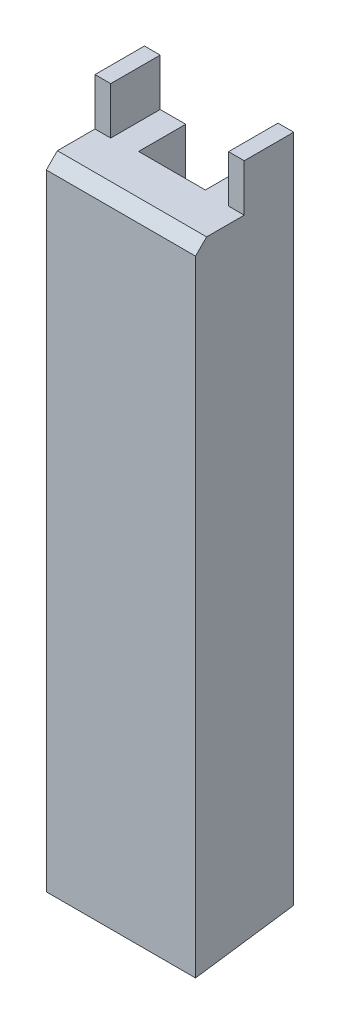
ISO-10303-21;
HEADER;
FILE_DESCRIPTION(('STEP AP214'),'2;1');
FILE_NAME('part.step','',(''),(''),'','','');
FILE_SCHEMA(('AUTOMOTIVE_DESIGN { 1 0 10303 214 1 1 1 1 }'));
ENDSEC;
DATA;
#1=APPLICATION_CONTEXT('core data for automotive mechanical design processes');
#2=APPLICATION_PROTOCOL_DEFINITION('international standard','automotive_design',2000,#1);
#3=PRODUCT_CONTEXT('',#1,'mechanical');
#4=PRODUCT('Part','Part','',(#3));
#5=PRODUCT_RELATED_PRODUCT_CATEGORY('part','',(#4));
#6=PRODUCT_DEFINITION_FORMATION('','',#4);
#7=PRODUCT_DEFINITION_CONTEXT('part definition',#1,'design');
#8=PRODUCT_DEFINITION('design','',#6,#7);
#9=PRODUCT_DEFINITION_SHAPE('','',#8);
#10=(LENGTH_UNIT() NAMED_UNIT(*) SI_UNIT(.MILLI.,.METRE.));
#11=(NAMED_UNIT(*) PLANE_ANGLE_UNIT() SI_UNIT($,.RADIAN.));
#12=(NAMED_UNIT(*) SI_UNIT($,.STERADIAN.) SOLID_ANGLE_UNIT());
#13=UNCERTAINTY_MEASURE_WITH_UNIT(LENGTH_MEASURE(1.E-05),#10,'distance_accuracy_value','');
#14=(GEOMETRIC_REPRESENTATION_CONTEXT(3) GLOBAL_UNCERTAINTY_ASSIGNED_CONTEXT((#13)) GLOBAL_UNIT_ASSIGNED_CONTEXT((#10,
#11,#12)) REPRESENTATION_CONTEXT('',''));
#15=CARTESIAN_POINT('',(0.,0.,0.));
#16=DIRECTION('',(0.,0.,1.));
#17=DIRECTION('',(1.,0.,0.));
#18=AXIS2_PLACEMENT_3D('',#15,#16,#17);
#19=CARTESIAN_POINT('',(-9.71428571428572,13.1911764705882,12.5));
#20=DIRECTION('',(0.,-1.,0.));
#21=DIRECTION('',(0.,0.,-1.));
#22=AXIS2_PLACEMENT_3D('',#19,#20,#21);
#23=PLANE('',#22);
#24=DIRECTION('',(0.,0.,1.));
#25=VECTOR('',#24,1.);
#26=CARTESIAN_POINT('',(7.28571428571428,13.1911764705882,0.));
#27=LINE('',#26,#25);
#28=CARTESIAN_POINT('',(7.28571428571428,13.1911764705882,0.));
#29=VERTEX_POINT('',#28);
#30=CARTESIAN_POINT('',(7.28571428571428,13.1911764705882,6.3));
#31=VERTEX_POINT('',#30);
#32=EDGE_CURVE('E169',#29,#31,#27,.T.);
#33=ORIENTED_EDGE('',*,*,#32,.F.);
#34=DIRECTION('',(-1.,0.,0.));
#35=VECTOR('',#34,1.);
#36=CARTESIAN_POINT('',(-9.71428571428572,13.1911764705882,0.));
#37=LINE('',#36,#35);
#38=CARTESIAN_POINT('',(4.03571428571429,13.1911764705882,0.));
#39=VERTEX_POINT('',#38);
#40=EDGE_CURVE('E245',#29,#39,#37,.T.);
#41=ORIENTED_EDGE('',*,*,#40,.T.);
#42=DIRECTION('',(0.,0.,-1.));
#43=VECTOR('',#42,1.);
#44=CARTESIAN_POINT('',(4.03571428571429,13.1911764705882,6.));
#45=LINE('',#44,#43);
#46=CARTESIAN_POINT('',(4.03571428571429,13.1911764705882,6.));
#47=VERTEX_POINT('',#46);
#48=EDGE_CURVE('E237',#47,#39,#45,.T.);
#49=ORIENTED_EDGE('',*,*,#48,.F.);
#50=DIRECTION('',(1.,0.,0.));
#51=VECTOR('',#50,1.);
#52=CARTESIAN_POINT('',(4.03571428571429,13.1911764705882,6.));
#53=LINE('',#52,#51);
#54=CARTESIAN_POINT('',(-4.46428571428571,13.1911764705882,6.));
#55=VERTEX_POINT('',#54);
#56=EDGE_CURVE('E230',#55,#47,#53,.T.);
#57=ORIENTED_EDGE('',*,*,#56,.F.);
#58=DIRECTION('',(0.,0.,-1.));
#59=VECTOR('',#58,1.);
#60=CARTESIAN_POINT('',(-4.46428571428571,13.1911764705882,6.));
#61=LINE('',#60,#59);
#62=CARTESIAN_POINT('',(-4.46428571428571,13.1911764705882,0.));
#63=VERTEX_POINT('',#62);
#64=EDGE_CURVE('E233',#55,#63,#61,.T.);
#65=ORIENTED_EDGE('',*,*,#64,.T.);
#66=CARTESIAN_POINT('',(-7.71428571428572,13.1911764705882,0.));
#67=VERTEX_POINT('',#66);
#68=EDGE_CURVE('E152',#63,#67,#37,.T.);
#69=ORIENTED_EDGE('',*,*,#68,.T.);
#70=DIRECTION('',(0.,0.,-1.));
#71=VECTOR('',#70,1.);
#72=CARTESIAN_POINT('',(-7.71428571428572,13.1911764705882,0.));
#73=LINE('',#72,#71);
#74=CARTESIAN_POINT('',(-7.71428571428572,13.1911764705882,6.3));
#75=VERTEX_POINT('',#74);
#76=EDGE_CURVE('E186',#75,#67,#73,.T.);
#77=ORIENTED_EDGE('',*,*,#76,.F.);
#78=DIRECTION('',(1.,0.,0.));
#79=VECTOR('',#78,1.);
#80=CARTESIAN_POINT('',(-9.71428571428572,13.1911764705882,6.3));
#81=LINE('',#80,#79);
#82=CARTESIAN_POINT('',(-9.71428571428572,13.1911764705882,6.3));
#83=VERTEX_POINT('',#82);
#84=EDGE_CURVE('E181',#83,#75,#81,.T.);
#85=ORIENTED_EDGE('',*,*,#84,.F.);
#86=DIRECTION('',(0.,0.,-1.));
#87=VECTOR('',#86,1.);
#88=CARTESIAN_POINT('',(-9.71428571428572,13.1911764705882,12.5));
#89=LINE('',#88,#87);
#90=CARTESIAN_POINT('',(-9.71428571428572,13.1911764705882,11.0857864376269));
#91=VERTEX_POINT('',#90);
#92=EDGE_CURVE('E251',#91,#83,#89,.T.);
#93=ORIENTED_EDGE('',*,*,#92,.F.);
#94=DIRECTION('',(-1.,0.,0.));
#95=VECTOR('',#94,1.);
#96=CARTESIAN_POINT('',(-9.71428571428572,13.1911764705882,11.0857864376269));
#97=LINE('',#96,#95);
#98=CARTESIAN_POINT('',(9.28571428571428,13.1911764705882,11.0857864376269));
#99=VERTEX_POINT('',#98);
#100=EDGE_CURVE('E210',#99,#91,#97,.T.);
#101=ORIENTED_EDGE('',*,*,#100,.F.);
#102=DIRECTION('',(0.,0.,-1.));
#103=VECTOR('',#102,1.);
#104=CARTESIAN_POINT('',(9.28571428571428,13.1911764705882,12.5));
#105=LINE('',#104,#103);
#106=CARTESIAN_POINT('',(9.28571428571428,13.1911764705882,6.3));
#107=VERTEX_POINT('',#106);
#108=EDGE_CURVE('E53',#99,#107,#105,.T.);
#109=ORIENTED_EDGE('',*,*,#108,.T.);
#110=DIRECTION('',(1.,0.,0.));
#111=VECTOR('',#110,1.);
#112=CARTESIAN_POINT('',(9.28571428571428,13.1911764705882,6.3));
#113=LINE('',#112,#111);
#114=EDGE_CURVE('E48',#31,#107,#113,.T.);
#115=ORIENTED_EDGE('',*,*,#114,.F.);
#116=EDGE_LOOP('',(#33,#41,#49,#57,#65,#69,#77,#85,#93,#101,#109,#115));
#117=FACE_BOUND('',#116,.T.);
#118=ADVANCED_FACE('F33',(#117),#23,.F.);
#119=CARTESIAN_POINT('',(-9.71428571428572,13.1911764705882,12.5));
#120=DIRECTION('',(1.,0.,0.));
#121=DIRECTION('',(0.,1.,0.));
#122=AXIS2_PLACEMENT_3D('',#119,#120,#121);
#123=PLANE('',#122);
#124=DIRECTION('',(0.,-0.707106781186549,0.707106781186546));
#125=VECTOR('',#124,1.);
#126=CARTESIAN_POINT('',(-9.71428571428572,12.4840696894017,11.7928932188135));
#127=LINE('',#126,#125);
#128=CARTESIAN_POINT('',(-9.71428571428572,11.7769629082151,12.5));
#129=VERTEX_POINT('',#128);
#130=EDGE_CURVE('E208',#91,#129,#127,.T.);
#131=ORIENTED_EDGE('',*,*,#130,.F.);
#132=ORIENTED_EDGE('',*,*,#92,.T.);
#133=DIRECTION('',(0.,-1.,0.));
#134=VECTOR('',#133,1.);
#135=CARTESIAN_POINT('',(-9.71428571428572,19.1911764705882,6.3));
#136=LINE('',#135,#134);
#137=CARTESIAN_POINT('',(-9.71428571428572,19.1911764705882,6.3));
#138=VERTEX_POINT('',#137);
#139=EDGE_CURVE('E203',#138,#83,#136,.T.);
#140=ORIENTED_EDGE('',*,*,#139,.F.);
#141=DIRECTION('',(0.,0.,1.));
#142=VECTOR('',#141,1.);
#143=CARTESIAN_POINT('',(-9.71428571428572,19.1911764705882,0.));
#144=LINE('',#143,#142);
#145=CARTESIAN_POINT('',(-9.71428571428572,19.1911764705882,0.));
#146=VERTEX_POINT('',#145);
#147=EDGE_CURVE('E182',#146,#138,#144,.T.);
#148=ORIENTED_EDGE('',*,*,#147,.F.);
#149=DIRECTION('',(0.,-1.,0.));
#150=VECTOR('',#149,1.);
#151=CARTESIAN_POINT('',(-9.71428571428572,13.1911764705882,0.));
#152=LINE('',#151,#150);
#153=CARTESIAN_POINT('',(-9.71428571428572,-66.0520630956319,0.));
#154=VERTEX_POINT('',#153);
#155=EDGE_CURVE('E153',#146,#154,#152,.T.);
#156=ORIENTED_EDGE('',*,*,#155,.T.);
#157=DIRECTION('',(0.,0.139173100960066,-0.99026806874157));
#158=VECTOR('',#157,1.);
#159=CARTESIAN_POINT('',(-9.71428571428571,-66.2399222149137,1.3366870894115));
#160=LINE('',#159,#158);
#161=CARTESIAN_POINT('',(-9.71428571428571,-67.8088235294118,12.5));
#162=VERTEX_POINT('',#161);
#163=EDGE_CURVE('E218',#162,#154,#160,.T.);
#164=ORIENTED_EDGE('',*,*,#163,.F.);
#165=DIRECTION('',(0.,-1.,0.));
#166=VECTOR('',#165,1.);
#167=CARTESIAN_POINT('',(-9.71428571428572,13.1911764705882,12.5));
#168=LINE('',#167,#166);
#169=EDGE_CURVE('E242',#129,#162,#168,.T.);
#170=ORIENTED_EDGE('',*,*,#169,.F.);
#171=EDGE_LOOP('',(#131,#132,#140,#148,#156,#164,#170));
#172=FACE_BOUND('',#171,.T.);
#173=ADVANCED_FACE('F35',(#172),#123,.F.);
#174=CARTESIAN_POINT('',(9.28571428571428,13.1911764705882,12.5));
#175=DIRECTION('',(-1.,0.,0.));
#176=DIRECTION('',(0.,-1.,0.));
#177=AXIS2_PLACEMENT_3D('',#174,#175,#176);
#178=PLANE('',#177);
#179=DIRECTION('',(0.,0.707106781186549,-0.707106781186546));
#180=VECTOR('',#179,1.);
#181=CARTESIAN_POINT('',(9.28571428571428,12.4840696894017,11.7928932188135));
#182=LINE('',#181,#180);
#183=CARTESIAN_POINT('',(9.28571428571429,11.7769629082151,12.5));
#184=VERTEX_POINT('',#183);
#185=EDGE_CURVE('E206',#184,#99,#182,.T.);
#186=ORIENTED_EDGE('',*,*,#185,.F.);
#187=DIRECTION('',(0.,1.,0.));
#188=VECTOR('',#187,1.);
#189=CARTESIAN_POINT('',(9.28571428571428,13.1911764705882,12.5));
#190=LINE('',#189,#188);
#191=CARTESIAN_POINT('',(9.28571428571429,-67.8088235294118,12.5));
#192=VERTEX_POINT('',#191);
#193=EDGE_CURVE('E248',#192,#184,#190,.T.);
#194=ORIENTED_EDGE('',*,*,#193,.F.);
#195=DIRECTION('',(0.,-0.139173100960066,0.99026806874157));
#196=VECTOR('',#195,1.);
#197=CARTESIAN_POINT('',(9.28571428571429,-66.2399222149137,1.3366870894115));
#198=LINE('',#197,#196);
#199=CARTESIAN_POINT('',(9.28571428571429,-66.0520630956319,0.));
#200=VERTEX_POINT('',#199);
#201=EDGE_CURVE('E149',#200,#192,#198,.T.);
#202=ORIENTED_EDGE('',*,*,#201,.F.);
#203=DIRECTION('',(0.,1.,0.));
#204=VECTOR('',#203,1.);
#205=CARTESIAN_POINT('',(9.28571428571428,13.1911764705882,0.));
#206=LINE('',#205,#204);
#207=CARTESIAN_POINT('',(9.28571428571428,19.1911764705882,0.));
#208=VERTEX_POINT('',#207);
#209=EDGE_CURVE('E141',#200,#208,#206,.T.);
#210=ORIENTED_EDGE('',*,*,#209,.T.);
#211=DIRECTION('',(0.,0.,-1.));
#212=VECTOR('',#211,1.);
#213=CARTESIAN_POINT('',(9.28571428571428,19.1911764705882,0.));
#214=LINE('',#213,#212);
#215=CARTESIAN_POINT('',(9.28571428571428,19.1911764705882,6.3));
#216=VERTEX_POINT('',#215);
#217=EDGE_CURVE('E147',#216,#208,#214,.T.);
#218=ORIENTED_EDGE('',*,*,#217,.F.);
#219=DIRECTION('',(0.,-1.,0.));
#220=VECTOR('',#219,1.);
#221=CARTESIAN_POINT('',(9.28571428571428,19.1911764705882,6.3));
#222=LINE('',#221,#220);
#223=EDGE_CURVE('E174',#216,#107,#222,.T.);
#224=ORIENTED_EDGE('',*,*,#223,.T.);
#225=ORIENTED_EDGE('',*,*,#108,.F.);
#226=EDGE_LOOP('',(#186,#194,#202,#210,#218,#224,#225));
#227=FACE_BOUND('',#226,.T.);
#228=ADVANCED_FACE('F144',(#227),#178,.F.);
#229=CARTESIAN_POINT('',(0.,0.,12.5));
#230=DIRECTION('',(0.,0.,1.));
#231=DIRECTION('',(1.,0.,0.));
#232=AXIS2_PLACEMENT_3D('',#229,#230,#231);
#233=PLANE('',#232);
#234=ORIENTED_EDGE('',*,*,#193,.T.);
#235=DIRECTION('',(-1.,0.,0.));
#236=VECTOR('',#235,1.);
#237=CARTESIAN_POINT('',(0.,11.7769629082151,12.5));
#238=LINE('',#237,#236);
#239=EDGE_CURVE('E11',#184,#129,#238,.T.);
#240=ORIENTED_EDGE('',*,*,#239,.T.);
#241=ORIENTED_EDGE('',*,*,#169,.T.);
#242=DIRECTION('',(1.,0.,0.));
#243=VECTOR('',#242,1.);
#244=CARTESIAN_POINT('',(-9.71428571428571,-67.8088235294118,12.5));
#245=LINE('',#244,#243);
#246=EDGE_CURVE('E244',#162,#192,#245,.T.);
#247=ORIENTED_EDGE('',*,*,#246,.T.);
#248=EDGE_LOOP('',(#234,#240,#241,#247));
#249=FACE_BOUND('',#248,.T.);
#250=ADVANCED_FACE('F278',(#249),#233,.T.);
#251=CARTESIAN_POINT('',(0.,0.,0.));
#252=DIRECTION('',(0.,0.,1.));
#253=DIRECTION('',(1.,0.,0.));
#254=AXIS2_PLACEMENT_3D('',#251,#252,#253);
#255=PLANE('',#254);
#256=DIRECTION('',(1.,0.,0.));
#257=VECTOR('',#256,1.);
#258=CARTESIAN_POINT('',(0.,-66.0520630956319,0.));
#259=LINE('',#258,#257);
#260=CARTESIAN_POINT('',(4.03571428571428,-66.0520630956319,0.));
#261=VERTEX_POINT('',#260);
#262=EDGE_CURVE('E220',#261,#200,#259,.T.);
#263=ORIENTED_EDGE('',*,*,#262,.F.);
#264=DIRECTION('',(0.,-1.,0.));
#265=VECTOR('',#264,1.);
#266=CARTESIAN_POINT('',(4.03571428571429,13.1911764705882,0.));
#267=LINE('',#266,#265);
#268=EDGE_CURVE('E223',#39,#261,#267,.T.);
#269=ORIENTED_EDGE('',*,*,#268,.F.);
#270=ORIENTED_EDGE('',*,*,#40,.F.);
#271=DIRECTION('',(0.,-1.,0.));
#272=VECTOR('',#271,1.);
#273=CARTESIAN_POINT('',(7.28571428571428,19.1911764705882,0.));
#274=LINE('',#273,#272);
#275=CARTESIAN_POINT('',(7.28571428571428,19.1911764705882,0.));
#276=VERTEX_POINT('',#275);
#277=EDGE_CURVE('E159',#276,#29,#274,.T.);
#278=ORIENTED_EDGE('',*,*,#277,.F.);
#279=DIRECTION('',(-1.,0.,0.));
#280=VECTOR('',#279,1.);
#281=CARTESIAN_POINT('',(9.28571428571428,19.1911764705882,0.));
#282=LINE('',#281,#280);
#283=EDGE_CURVE('E156',#208,#276,#282,.T.);
#284=ORIENTED_EDGE('',*,*,#283,.F.);
#285=ORIENTED_EDGE('',*,*,#209,.F.);
#286=EDGE_LOOP('',(#263,#269,#270,#278,#284,#285));
#287=FACE_BOUND('',#286,.T.);
#288=ADVANCED_FACE('F157',(#287),#255,.F.);
#289=DIRECTION('',(1.,0.,0.));
#290=VECTOR('',#289,1.);
#291=CARTESIAN_POINT('',(0.,-66.0520630956319,0.));
#292=LINE('',#291,#290);
#293=CARTESIAN_POINT('',(-4.46428571428572,-66.0520630956319,0.));
#294=VERTEX_POINT('',#293);
#295=EDGE_CURVE('E216',#154,#294,#292,.T.);
#296=ORIENTED_EDGE('',*,*,#295,.F.);
#297=ORIENTED_EDGE('',*,*,#155,.F.);
#298=DIRECTION('',(-1.,0.,0.));
#299=VECTOR('',#298,1.);
#300=CARTESIAN_POINT('',(-9.71428571428572,19.1911764705882,0.));
#301=LINE('',#300,#299);
#302=CARTESIAN_POINT('',(-7.71428571428572,19.1911764705882,0.));
#303=VERTEX_POINT('',#302);
#304=EDGE_CURVE('E190',#303,#146,#301,.T.);
#305=ORIENTED_EDGE('',*,*,#304,.F.);
#306=DIRECTION('',(0.,-1.,0.));
#307=VECTOR('',#306,1.);
#308=CARTESIAN_POINT('',(-7.71428571428572,19.1911764705882,0.));
#309=LINE('',#308,#307);
#310=EDGE_CURVE('E193',#303,#67,#309,.T.);
#311=ORIENTED_EDGE('',*,*,#310,.T.);
#312=ORIENTED_EDGE('',*,*,#68,.F.);
#313=DIRECTION('',(0.,1.,0.));
#314=VECTOR('',#313,1.);
#315=CARTESIAN_POINT('',(-4.46428571428571,13.1911764705882,0.));
#316=LINE('',#315,#314);
#317=EDGE_CURVE('E228',#294,#63,#316,.T.);
#318=ORIENTED_EDGE('',*,*,#317,.F.);
#319=EDGE_LOOP('',(#296,#297,#305,#311,#312,#318));
#320=FACE_BOUND('',#319,.T.);
#321=ADVANCED_FACE('F296',(#320),#255,.F.);
#322=CARTESIAN_POINT('',(4.03571428571429,13.1911764705882,6.));
#323=DIRECTION('',(1.,0.,0.));
#324=DIRECTION('',(0.,1.,0.));
#325=AXIS2_PLACEMENT_3D('',#322,#323,#324);
#326=PLANE('',#325);
#327=DIRECTION('',(0.,0.139173100960066,-0.99026806874157));
#328=VECTOR('',#327,1.);
#329=CARTESIAN_POINT('',(4.03571428571428,-65.3441008085085,-5.03741342238804));
#330=LINE('',#329,#328);
#331=CARTESIAN_POINT('',(4.03571428571429,-66.8953081038462,6.));
#332=VERTEX_POINT('',#331);
#333=EDGE_CURVE('E214',#332,#261,#330,.T.);
#334=ORIENTED_EDGE('',*,*,#333,.F.);
#335=DIRECTION('',(0.,-1.,0.));
#336=VECTOR('',#335,1.);
#337=CARTESIAN_POINT('',(4.03571428571429,13.1911764705882,6.));
#338=LINE('',#337,#336);
#339=EDGE_CURVE('E224',#47,#332,#338,.T.);
#340=ORIENTED_EDGE('',*,*,#339,.F.);
#341=ORIENTED_EDGE('',*,*,#48,.T.);
#342=ORIENTED_EDGE('',*,*,#268,.T.);
#343=EDGE_LOOP('',(#334,#340,#341,#342));
#344=FACE_BOUND('',#343,.T.);
#345=ADVANCED_FACE('F273',(#344),#326,.F.);
#346=CARTESIAN_POINT('',(-4.46428571428571,13.1911764705882,6.));
#347=DIRECTION('',(-1.,0.,0.));
#348=DIRECTION('',(0.,-1.,0.));
#349=AXIS2_PLACEMENT_3D('',#346,#347,#348);
#350=PLANE('',#349);
#351=DIRECTION('',(0.,-0.139173100960066,0.99026806874157));
#352=VECTOR('',#351,1.);
#353=CARTESIAN_POINT('',(-4.46428571428572,-65.3441008085085,-5.03741342238804));
#354=LINE('',#353,#352);
#355=CARTESIAN_POINT('',(-4.46428571428572,-66.8953081038462,6.));
#356=VERTEX_POINT('',#355);
#357=EDGE_CURVE('E212',#294,#356,#354,.T.);
#358=ORIENTED_EDGE('',*,*,#357,.F.);
#359=ORIENTED_EDGE('',*,*,#317,.T.);
#360=ORIENTED_EDGE('',*,*,#64,.F.);
#361=DIRECTION('',(0.,1.,0.));
#362=VECTOR('',#361,1.);
#363=CARTESIAN_POINT('',(-4.46428571428571,13.1911764705882,6.));
#364=LINE('',#363,#362);
#365=EDGE_CURVE('E227',#356,#55,#364,.T.);
#366=ORIENTED_EDGE('',*,*,#365,.F.);
#367=EDGE_LOOP('',(#358,#359,#360,#366));
#368=FACE_BOUND('',#367,.T.);
#369=ADVANCED_FACE('F266',(#368),#350,.F.);
#370=CARTESIAN_POINT('',(0.,0.,6.));
#371=DIRECTION('',(0.,0.,-1.));
#372=DIRECTION('',(-1.,0.,0.));
#373=AXIS2_PLACEMENT_3D('',#370,#371,#372);
#374=PLANE('',#373);
#375=ORIENTED_EDGE('',*,*,#339,.T.);
#376=DIRECTION('',(-1.,0.,0.));
#377=VECTOR('',#376,1.);
#378=CARTESIAN_POINT('',(0.,-66.8953081038462,6.));
#379=LINE('',#378,#377);
#380=EDGE_CURVE('E41',#332,#356,#379,.T.);
#381=ORIENTED_EDGE('',*,*,#380,.T.);
#382=ORIENTED_EDGE('',*,*,#365,.T.);
#383=ORIENTED_EDGE('',*,*,#56,.T.);
#384=EDGE_LOOP('',(#375,#381,#382,#383));
#385=FACE_BOUND('',#384,.T.);
#386=ADVANCED_FACE('F260',(#385),#374,.T.);
#387=CARTESIAN_POINT('',(0.,-64.7726906435819,-9.10320800896881));
#388=DIRECTION('',(0.,-0.99026806874157,-0.139173100960066));
#389=DIRECTION('',(0.,0.139173100960066,-0.99026806874157));
#390=AXIS2_PLACEMENT_3D('',#387,#388,#389);
#391=PLANE('',#390);
#392=ORIENTED_EDGE('',*,*,#201,.T.);
#393=ORIENTED_EDGE('',*,*,#246,.F.);
#394=ORIENTED_EDGE('',*,*,#163,.T.);
#395=ORIENTED_EDGE('',*,*,#295,.T.);
#396=ORIENTED_EDGE('',*,*,#357,.T.);
#397=ORIENTED_EDGE('',*,*,#380,.F.);
#398=ORIENTED_EDGE('',*,*,#333,.T.);
#399=ORIENTED_EDGE('',*,*,#262,.T.);
#400=EDGE_LOOP('',(#392,#393,#394,#395,#396,#397,#398,#399));
#401=FACE_BOUND('',#400,.T.);
#402=ADVANCED_FACE('F274',(#401),#391,.T.);
#403=CARTESIAN_POINT('',(0.,12.1384814541076,12.1384814541076));
#404=DIRECTION('',(0.,0.707106781186546,0.707106781186549));
#405=DIRECTION('',(0.,-0.707106781186549,0.707106781186546));
#406=AXIS2_PLACEMENT_3D('',#403,#404,#405);
#407=PLANE('',#406);
#408=ORIENTED_EDGE('',*,*,#100,.T.);
#409=ORIENTED_EDGE('',*,*,#130,.T.);
#410=ORIENTED_EDGE('',*,*,#239,.F.);
#411=ORIENTED_EDGE('',*,*,#185,.T.);
#412=EDGE_LOOP('',(#408,#409,#410,#411));
#413=FACE_BOUND('',#412,.T.);
#414=ADVANCED_FACE('F281',(#413),#407,.T.);
#415=CARTESIAN_POINT('',(-9.71428571428572,19.1911764705882,6.3));
#416=DIRECTION('',(0.,0.,-1.));
#417=DIRECTION('',(-1.,0.,0.));
#418=AXIS2_PLACEMENT_3D('',#415,#416,#417);
#419=PLANE('',#418);
#420=ORIENTED_EDGE('',*,*,#84,.T.);
#421=DIRECTION('',(0.,-1.,0.));
#422=VECTOR('',#421,1.);
#423=CARTESIAN_POINT('',(-7.71428571428572,19.1911764705882,6.3));
#424=LINE('',#423,#422);
#425=CARTESIAN_POINT('',(-7.71428571428572,19.1911764705882,6.3));
#426=VERTEX_POINT('',#425);
#427=EDGE_CURVE('E200',#426,#75,#424,.T.);
#428=ORIENTED_EDGE('',*,*,#427,.F.);
#429=DIRECTION('',(1.,0.,0.));
#430=VECTOR('',#429,1.);
#431=CARTESIAN_POINT('',(-9.71428571428572,19.1911764705882,6.3));
#432=LINE('',#431,#430);
#433=EDGE_CURVE('E185',#138,#426,#432,.T.);
#434=ORIENTED_EDGE('',*,*,#433,.F.);
#435=ORIENTED_EDGE('',*,*,#139,.T.);
#436=EDGE_LOOP('',(#420,#428,#434,#435));
#437=FACE_BOUND('',#436,.T.);
#438=ADVANCED_FACE('F288',(#437),#419,.F.);
#439=CARTESIAN_POINT('',(-7.71428571428572,19.1911764705882,0.));
#440=DIRECTION('',(-1.,0.,0.));
#441=DIRECTION('',(0.,0.,1.));
#442=AXIS2_PLACEMENT_3D('',#439,#440,#441);
#443=PLANE('',#442);
#444=ORIENTED_EDGE('',*,*,#76,.T.);
#445=ORIENTED_EDGE('',*,*,#310,.F.);
#446=DIRECTION('',(0.,0.,-1.));
#447=VECTOR('',#446,1.);
#448=CARTESIAN_POINT('',(-7.71428571428572,19.1911764705882,0.));
#449=LINE('',#448,#447);
#450=EDGE_CURVE('E188',#426,#303,#449,.T.);
#451=ORIENTED_EDGE('',*,*,#450,.F.);
#452=ORIENTED_EDGE('',*,*,#427,.T.);
#453=EDGE_LOOP('',(#444,#445,#451,#452));
#454=FACE_BOUND('',#453,.T.);
#455=ADVANCED_FACE('F299',(#454),#443,.F.);
#456=CARTESIAN_POINT('',(0.,19.1911764705882,0.));
#457=DIRECTION('',(0.,1.,0.));
#458=DIRECTION('',(0.,0.,1.));
#459=AXIS2_PLACEMENT_3D('',#456,#457,#458);
#460=PLANE('',#459);
#461=ORIENTED_EDGE('',*,*,#147,.T.);
#462=ORIENTED_EDGE('',*,*,#433,.T.);
#463=ORIENTED_EDGE('',*,*,#450,.T.);
#464=ORIENTED_EDGE('',*,*,#304,.T.);
#465=EDGE_LOOP('',(#461,#462,#463,#464));
#466=FACE_BOUND('',#465,.T.);
#467=ADVANCED_FACE('F292',(#466),#460,.T.);
#468=CARTESIAN_POINT('',(7.28571428571428,19.1911764705882,0.));
#469=DIRECTION('',(1.,0.,0.));
#470=DIRECTION('',(0.,0.,-1.));
#471=AXIS2_PLACEMENT_3D('',#468,#469,#470);
#472=PLANE('',#471);
#473=ORIENTED_EDGE('',*,*,#32,.T.);
#474=DIRECTION('',(0.,-1.,0.));
#475=VECTOR('',#474,1.);
#476=CARTESIAN_POINT('',(7.28571428571428,19.1911764705882,6.3));
#477=LINE('',#476,#475);
#478=CARTESIAN_POINT('',(7.28571428571428,19.1911764705882,6.3));
#479=VERTEX_POINT('',#478);
#480=EDGE_CURVE('E177',#479,#31,#477,.T.);
#481=ORIENTED_EDGE('',*,*,#480,.F.);
#482=DIRECTION('',(0.,0.,1.));
#483=VECTOR('',#482,1.);
#484=CARTESIAN_POINT('',(7.28571428571428,19.1911764705882,0.));
#485=LINE('',#484,#483);
#486=EDGE_CURVE('E162',#276,#479,#485,.T.);
#487=ORIENTED_EDGE('',*,*,#486,.F.);
#488=ORIENTED_EDGE('',*,*,#277,.T.);
#489=EDGE_LOOP('',(#473,#481,#487,#488));
#490=FACE_BOUND('',#489,.T.);
#491=ADVANCED_FACE('F306',(#490),#472,.F.);
#492=CARTESIAN_POINT('',(9.28571428571428,19.1911764705882,6.3));
#493=DIRECTION('',(0.,0.,-1.));
#494=DIRECTION('',(-1.,0.,0.));
#495=AXIS2_PLACEMENT_3D('',#492,#493,#494);
#496=PLANE('',#495);
#497=ORIENTED_EDGE('',*,*,#114,.T.);
#498=ORIENTED_EDGE('',*,*,#223,.F.);
#499=DIRECTION('',(1.,0.,0.));
#500=VECTOR('',#499,1.);
#501=CARTESIAN_POINT('',(9.28571428571428,19.1911764705882,6.3));
#502=LINE('',#501,#500);
#503=EDGE_CURVE('E166',#479,#216,#502,.T.);
#504=ORIENTED_EDGE('',*,*,#503,.F.);
#505=ORIENTED_EDGE('',*,*,#480,.T.);
#506=EDGE_LOOP('',(#497,#498,#504,#505));
#507=FACE_BOUND('',#506,.T.);
#508=ADVANCED_FACE('F365',(#507),#496,.F.);
#509=CARTESIAN_POINT('',(0.,19.1911764705882,0.));
#510=DIRECTION('',(0.,-1.,0.));
#511=DIRECTION('',(0.,0.,-1.));
#512=AXIS2_PLACEMENT_3D('',#509,#510,#511);
#513=PLANE('',#512);
#514=ORIENTED_EDGE('',*,*,#217,.T.);
#515=ORIENTED_EDGE('',*,*,#283,.T.);
#516=ORIENTED_EDGE('',*,*,#486,.T.);
#517=ORIENTED_EDGE('',*,*,#503,.T.);
#518=EDGE_LOOP('',(#514,#515,#516,#517));
#519=FACE_BOUND('',#518,.T.);
#520=ADVANCED_FACE('F164',(#519),#513,.F.);
#521=CLOSED_SHELL('',(#118,#173,#228,#250,#288,#321,#345,#369,#386,#402,#414,#438,#455,#467,
#491,#508,#520));
#522=MANIFOLD_SOLID_BREP('B2',#521);
#523=ADVANCED_BREP_SHAPE_REPRESENTATION('',(#18,#522),#14);
#524=SHAPE_DEFINITION_REPRESENTATION(#9,#523);
ENDSEC;
END-ISO-10303-21;
